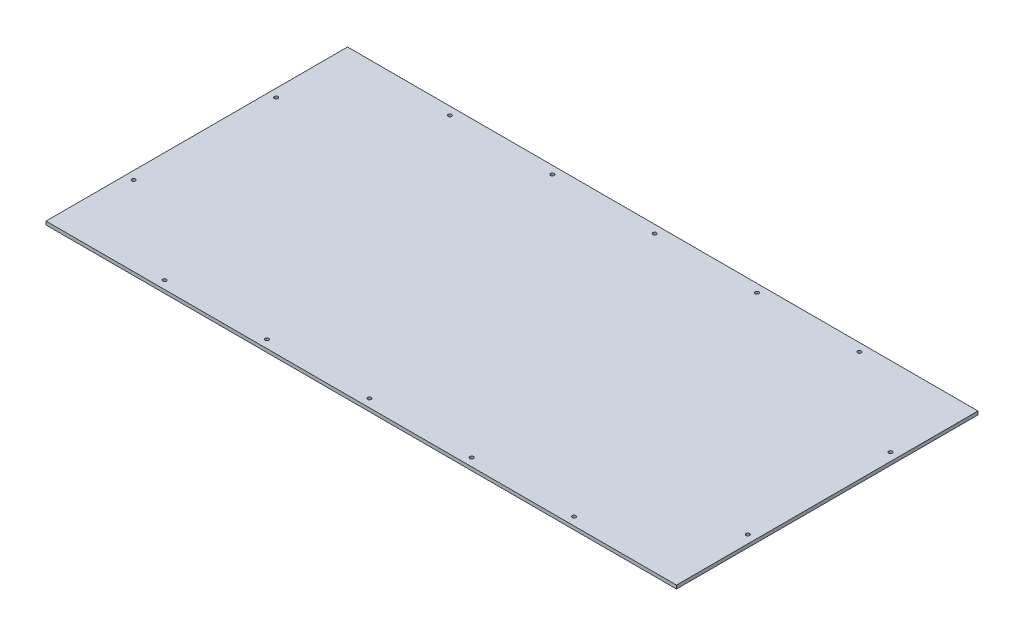
ISO-10303-21;
HEADER;
FILE_DESCRIPTION(('STEP AP214'),'2;1');
FILE_NAME('part.step','',(''),(''),'','','');
FILE_SCHEMA(('AUTOMOTIVE_DESIGN { 1 0 10303 214 1 1 1 1 }'));
ENDSEC;
DATA;
#1=APPLICATION_CONTEXT('core data for automotive mechanical design processes');
#2=APPLICATION_PROTOCOL_DEFINITION('international standard','automotive_design',2000,#1);
#3=PRODUCT_CONTEXT('',#1,'mechanical');
#4=PRODUCT('Part','Part','',(#3));
#5=PRODUCT_RELATED_PRODUCT_CATEGORY('part','',(#4));
#6=PRODUCT_DEFINITION_FORMATION('','',#4);
#7=PRODUCT_DEFINITION_CONTEXT('part definition',#1,'design');
#8=PRODUCT_DEFINITION('design','',#6,#7);
#9=PRODUCT_DEFINITION_SHAPE('','',#8);
#10=(LENGTH_UNIT() NAMED_UNIT(*) SI_UNIT(.MILLI.,.METRE.));
#11=(NAMED_UNIT(*) PLANE_ANGLE_UNIT() SI_UNIT($,.RADIAN.));
#12=(NAMED_UNIT(*) SI_UNIT($,.STERADIAN.) SOLID_ANGLE_UNIT());
#13=UNCERTAINTY_MEASURE_WITH_UNIT(LENGTH_MEASURE(1.E-05),#10,'distance_accuracy_value','');
#14=(GEOMETRIC_REPRESENTATION_CONTEXT(3) GLOBAL_UNCERTAINTY_ASSIGNED_CONTEXT((#13)) GLOBAL_UNIT_ASSIGNED_CONTEXT((#10,
#11,#12)) REPRESENTATION_CONTEXT('',''));
#15=CARTESIAN_POINT('',(0.,0.,0.));
#16=DIRECTION('',(0.,0.,1.));
#17=DIRECTION('',(1.,0.,0.));
#18=AXIS2_PLACEMENT_3D('',#15,#16,#17);
#19=CARTESIAN_POINT('',(0.,3.175,0.));
#20=DIRECTION('',(0.,1.,0.));
#21=DIRECTION('',(0.,0.,1.));
#22=AXIS2_PLACEMENT_3D('',#19,#20,#21);
#23=PLANE('',#22);
#24=CARTESIAN_POINT('',(1.66533453693773E-13,3.175,-132.2));
#25=DIRECTION('',(0.,1.,0.));
#26=DIRECTION('',(0.,0.,1.));
#27=AXIS2_PLACEMENT_3D('',#24,#25,#26);
#28=CIRCLE('',#27,1.65);
#29=CARTESIAN_POINT('',(1.66533453693773E-13,3.175,-130.55));
#30=VERTEX_POINT('',#29);
#31=EDGE_CURVE('E181',#30,#30,#28,.T.);
#32=ORIENTED_EDGE('',*,*,#31,.F.);
#33=EDGE_LOOP('',(#32));
#34=FACE_BOUND('',#33,.T.);
#35=CARTESIAN_POINT('',(284.6,3.175,66.0999999999999));
#36=DIRECTION('',(0.,1.,0.));
#37=DIRECTION('',(0.,0.,1.));
#38=AXIS2_PLACEMENT_3D('',#35,#36,#37);
#39=CIRCLE('',#38,1.64999999999999);
#40=CARTESIAN_POINT('',(284.6,3.175,67.7499999999999));
#41=VERTEX_POINT('',#40);
#42=EDGE_CURVE('E169',#41,#41,#39,.T.);
#43=ORIENTED_EDGE('',*,*,#42,.F.);
#44=EDGE_LOOP('',(#43));
#45=FACE_BOUND('',#44,.T.);
#46=CARTESIAN_POINT('',(94.8666666666667,3.175,-132.2));
#47=DIRECTION('',(0.,1.,0.));
#48=DIRECTION('',(0.,0.,-1.));
#49=AXIS2_PLACEMENT_3D('',#46,#47,#48);
#50=CIRCLE('',#49,1.65000000000002);
#51=CARTESIAN_POINT('',(94.8666666666667,3.175,-133.85));
#52=VERTEX_POINT('',#51);
#53=EDGE_CURVE('E157',#52,#52,#50,.T.);
#54=ORIENTED_EDGE('',*,*,#53,.F.);
#55=EDGE_LOOP('',(#54));
#56=FACE_BOUND('',#55,.T.);
#57=CARTESIAN_POINT('',(189.733333333333,3.175,132.2));
#58=DIRECTION('',(0.,1.,0.));
#59=DIRECTION('',(0.,0.,1.));
#60=AXIS2_PLACEMENT_3D('',#57,#58,#59);
#61=CIRCLE('',#60,1.65000000000002);
#62=CARTESIAN_POINT('',(189.733333333333,3.175,133.85));
#63=VERTEX_POINT('',#62);
#64=EDGE_CURVE('E145',#63,#63,#61,.T.);
#65=ORIENTED_EDGE('',*,*,#64,.F.);
#66=EDGE_LOOP('',(#65));
#67=FACE_BOUND('',#66,.T.);
#68=CARTESIAN_POINT('',(-94.8666666666666,3.175,132.2));
#69=DIRECTION('',(0.,1.,0.));
#70=DIRECTION('',(0.,0.,-1.));
#71=AXIS2_PLACEMENT_3D('',#68,#69,#70);
#72=CIRCLE('',#71,1.65000000000002);
#73=CARTESIAN_POINT('',(-94.8666666666666,3.175,130.55));
#74=VERTEX_POINT('',#73);
#75=EDGE_CURVE('E133',#74,#74,#72,.T.);
#76=ORIENTED_EDGE('',*,*,#75,.F.);
#77=EDGE_LOOP('',(#76));
#78=FACE_BOUND('',#77,.T.);
#79=CARTESIAN_POINT('',(-94.8666666666666,3.175,-132.2));
#80=DIRECTION('',(0.,1.,0.));
#81=DIRECTION('',(0.,0.,1.));
#82=AXIS2_PLACEMENT_3D('',#79,#80,#81);
#83=CIRCLE('',#82,1.65000000000002);
#84=CARTESIAN_POINT('',(-94.8666666666666,3.175,-130.55));
#85=VERTEX_POINT('',#84);
#86=EDGE_CURVE('E121',#85,#85,#83,.T.);
#87=ORIENTED_EDGE('',*,*,#86,.F.);
#88=EDGE_LOOP('',(#87));
#89=FACE_BOUND('',#88,.T.);
#90=CARTESIAN_POINT('',(-284.6,3.175,-66.1));
#91=DIRECTION('',(0.,1.,0.));
#92=DIRECTION('',(0.,0.,1.));
#93=AXIS2_PLACEMENT_3D('',#90,#91,#92);
#94=CIRCLE('',#93,1.64999999999999);
#95=CARTESIAN_POINT('',(-284.6,3.175,-64.45));
#96=VERTEX_POINT('',#95);
#97=EDGE_CURVE('E100',#96,#96,#94,.T.);
#98=ORIENTED_EDGE('',*,*,#97,.F.);
#99=EDGE_LOOP('',(#98));
#100=FACE_BOUND('',#99,.T.);
#101=DIRECTION('',(0.,0.,-1.));
#102=VECTOR('',#101,1.);
#103=CARTESIAN_POINT('',(292.1,3.175,-139.7));
#104=LINE('',#103,#102);
#105=CARTESIAN_POINT('',(292.1,3.175,139.7));
#106=VERTEX_POINT('',#105);
#107=CARTESIAN_POINT('',(292.1,3.175,-139.7));
#108=VERTEX_POINT('',#107);
#109=EDGE_CURVE('E85',#106,#108,#104,.T.);
#110=ORIENTED_EDGE('',*,*,#109,.T.);
#111=DIRECTION('',(-1.,0.,0.));
#112=VECTOR('',#111,1.);
#113=CARTESIAN_POINT('',(-292.1,3.175,-139.7));
#114=LINE('',#113,#112);
#115=CARTESIAN_POINT('',(-292.1,3.175,-139.7));
#116=VERTEX_POINT('',#115);
#117=EDGE_CURVE('E80',#108,#116,#114,.T.);
#118=ORIENTED_EDGE('',*,*,#117,.T.);
#119=DIRECTION('',(0.,0.,1.));
#120=VECTOR('',#119,1.);
#121=CARTESIAN_POINT('',(-292.1,3.175,-139.7));
#122=LINE('',#121,#120);
#123=CARTESIAN_POINT('',(-292.1,3.175,139.7));
#124=VERTEX_POINT('',#123);
#125=EDGE_CURVE('E83',#116,#124,#122,.T.);
#126=ORIENTED_EDGE('',*,*,#125,.T.);
#127=DIRECTION('',(1.,0.,0.));
#128=VECTOR('',#127,1.);
#129=CARTESIAN_POINT('',(-292.1,3.175,139.7));
#130=LINE('',#129,#128);
#131=EDGE_CURVE('E50',#124,#106,#130,.T.);
#132=ORIENTED_EDGE('',*,*,#131,.T.);
#133=EDGE_LOOP('',(#110,#118,#126,#132));
#134=FACE_BOUND('',#133,.T.);
#135=CARTESIAN_POINT('',(-189.733333333333,3.175,-132.2));
#136=DIRECTION('',(0.,1.,0.));
#137=DIRECTION('',(0.,0.,1.));
#138=AXIS2_PLACEMENT_3D('',#135,#136,#137);
#139=CIRCLE('',#138,1.65000000000002);
#140=CARTESIAN_POINT('',(-189.733333333333,3.175,-130.55));
#141=VERTEX_POINT('',#140);
#142=EDGE_CURVE('E115',#141,#141,#139,.T.);
#143=ORIENTED_EDGE('',*,*,#142,.F.);
#144=EDGE_LOOP('',(#143));
#145=FACE_BOUND('',#144,.T.);
#146=CARTESIAN_POINT('',(-284.6,3.175,66.0999999999999));
#147=DIRECTION('',(0.,1.,0.));
#148=DIRECTION('',(0.,0.,-1.));
#149=AXIS2_PLACEMENT_3D('',#146,#147,#148);
#150=CIRCLE('',#149,1.64999999999999);
#151=CARTESIAN_POINT('',(-284.6,3.175,64.4499999999999));
#152=VERTEX_POINT('',#151);
#153=EDGE_CURVE('E127',#152,#152,#150,.T.);
#154=ORIENTED_EDGE('',*,*,#153,.F.);
#155=EDGE_LOOP('',(#154));
#156=FACE_BOUND('',#155,.T.);
#157=CARTESIAN_POINT('',(-189.733333333333,3.175,132.2));
#158=DIRECTION('',(0.,1.,0.));
#159=DIRECTION('',(0.,0.,-1.));
#160=AXIS2_PLACEMENT_3D('',#157,#158,#159);
#161=CIRCLE('',#160,1.65000000000002);
#162=CARTESIAN_POINT('',(-189.733333333333,3.175,130.55));
#163=VERTEX_POINT('',#162);
#164=EDGE_CURVE('E139',#163,#163,#161,.T.);
#165=ORIENTED_EDGE('',*,*,#164,.F.);
#166=EDGE_LOOP('',(#165));
#167=FACE_BOUND('',#166,.T.);
#168=CARTESIAN_POINT('',(94.8666666666667,3.175,132.2));
#169=DIRECTION('',(0.,1.,0.));
#170=DIRECTION('',(0.,0.,1.));
#171=AXIS2_PLACEMENT_3D('',#168,#169,#170);
#172=CIRCLE('',#171,1.65000000000002);
#173=CARTESIAN_POINT('',(94.8666666666667,3.175,133.85));
#174=VERTEX_POINT('',#173);
#175=EDGE_CURVE('E151',#174,#174,#172,.T.);
#176=ORIENTED_EDGE('',*,*,#175,.F.);
#177=EDGE_LOOP('',(#176));
#178=FACE_BOUND('',#177,.T.);
#179=CARTESIAN_POINT('',(189.733333333333,3.175,-132.2));
#180=DIRECTION('',(0.,1.,0.));
#181=DIRECTION('',(0.,0.,-1.));
#182=AXIS2_PLACEMENT_3D('',#179,#180,#181);
#183=CIRCLE('',#182,1.65000000000002);
#184=CARTESIAN_POINT('',(189.733333333333,3.175,-133.85));
#185=VERTEX_POINT('',#184);
#186=EDGE_CURVE('E163',#185,#185,#183,.T.);
#187=ORIENTED_EDGE('',*,*,#186,.F.);
#188=EDGE_LOOP('',(#187));
#189=FACE_BOUND('',#188,.T.);
#190=CARTESIAN_POINT('',(284.6,3.175,-66.1));
#191=DIRECTION('',(0.,1.,0.));
#192=DIRECTION('',(0.,0.,-1.));
#193=AXIS2_PLACEMENT_3D('',#190,#191,#192);
#194=CIRCLE('',#193,1.64999999999999);
#195=CARTESIAN_POINT('',(284.6,3.175,-67.75));
#196=VERTEX_POINT('',#195);
#197=EDGE_CURVE('E175',#196,#196,#194,.T.);
#198=ORIENTED_EDGE('',*,*,#197,.F.);
#199=EDGE_LOOP('',(#198));
#200=FACE_BOUND('',#199,.T.);
#201=CARTESIAN_POINT('',(1.66533453693773E-13,3.175,132.2));
#202=DIRECTION('',(0.,1.,0.));
#203=DIRECTION('',(0.,0.,1.));
#204=AXIS2_PLACEMENT_3D('',#201,#202,#203);
#205=CIRCLE('',#204,1.65);
#206=CARTESIAN_POINT('',(1.66533453693773E-13,3.175,133.85));
#207=VERTEX_POINT('',#206);
#208=EDGE_CURVE('E187',#207,#207,#205,.T.);
#209=ORIENTED_EDGE('',*,*,#208,.F.);
#210=EDGE_LOOP('',(#209));
#211=FACE_BOUND('',#210,.T.);
#212=ADVANCED_FACE('F33',(#34,#45,#56,#67,#78,#89,#100,#134,#145,#156,#167,#178,#189,#200,#211),
#23,.T.);
#213=CARTESIAN_POINT('',(0.,0.,0.));
#214=DIRECTION('',(0.,1.,0.));
#215=DIRECTION('',(0.,0.,1.));
#216=AXIS2_PLACEMENT_3D('',#213,#214,#215);
#217=PLANE('',#216);
#218=DIRECTION('',(0.,0.,-1.));
#219=VECTOR('',#218,1.);
#220=CARTESIAN_POINT('',(292.1,0.,-139.7));
#221=LINE('',#220,#219);
#222=CARTESIAN_POINT('',(292.1,0.,139.7));
#223=VERTEX_POINT('',#222);
#224=CARTESIAN_POINT('',(292.1,0.,-139.7));
#225=VERTEX_POINT('',#224);
#226=EDGE_CURVE('E97',#223,#225,#221,.T.);
#227=ORIENTED_EDGE('',*,*,#226,.F.);
#228=DIRECTION('',(1.,0.,0.));
#229=VECTOR('',#228,1.);
#230=CARTESIAN_POINT('',(-292.1,0.,139.7));
#231=LINE('',#230,#229);
#232=CARTESIAN_POINT('',(-292.1,0.,139.7));
#233=VERTEX_POINT('',#232);
#234=EDGE_CURVE('E73',#233,#223,#231,.T.);
#235=ORIENTED_EDGE('',*,*,#234,.F.);
#236=DIRECTION('',(0.,0.,1.));
#237=VECTOR('',#236,1.);
#238=CARTESIAN_POINT('',(-292.1,0.,-139.7));
#239=LINE('',#238,#237);
#240=CARTESIAN_POINT('',(-292.1,0.,-139.7));
#241=VERTEX_POINT('',#240);
#242=EDGE_CURVE('E67',#241,#233,#239,.T.);
#243=ORIENTED_EDGE('',*,*,#242,.F.);
#244=DIRECTION('',(-1.,0.,0.));
#245=VECTOR('',#244,1.);
#246=CARTESIAN_POINT('',(-292.1,0.,-139.7));
#247=LINE('',#246,#245);
#248=EDGE_CURVE('E89',#225,#241,#247,.T.);
#249=ORIENTED_EDGE('',*,*,#248,.F.);
#250=EDGE_LOOP('',(#227,#235,#243,#249));
#251=FACE_BOUND('',#250,.T.);
#252=CARTESIAN_POINT('',(-284.6,0.,-66.1));
#253=DIRECTION('',(0.,1.,0.));
#254=DIRECTION('',(0.,0.,1.));
#255=AXIS2_PLACEMENT_3D('',#252,#253,#254);
#256=CIRCLE('',#255,1.64999999999999);
#257=CARTESIAN_POINT('',(-284.6,0.,-64.45));
#258=VERTEX_POINT('',#257);
#259=EDGE_CURVE('E112',#258,#258,#256,.T.);
#260=ORIENTED_EDGE('',*,*,#259,.T.);
#261=EDGE_LOOP('',(#260));
#262=FACE_BOUND('',#261,.T.);
#263=CARTESIAN_POINT('',(-189.733333333333,0.,-132.2));
#264=DIRECTION('',(0.,1.,0.));
#265=DIRECTION('',(0.,0.,1.));
#266=AXIS2_PLACEMENT_3D('',#263,#264,#265);
#267=CIRCLE('',#266,1.65000000000002);
#268=CARTESIAN_POINT('',(-189.733333333333,0.,-130.55));
#269=VERTEX_POINT('',#268);
#270=EDGE_CURVE('E118',#269,#269,#267,.T.);
#271=ORIENTED_EDGE('',*,*,#270,.T.);
#272=EDGE_LOOP('',(#271));
#273=FACE_BOUND('',#272,.T.);
#274=CARTESIAN_POINT('',(-94.8666666666666,0.,-132.2));
#275=DIRECTION('',(0.,1.,0.));
#276=DIRECTION('',(0.,0.,1.));
#277=AXIS2_PLACEMENT_3D('',#274,#275,#276);
#278=CIRCLE('',#277,1.65000000000002);
#279=CARTESIAN_POINT('',(-94.8666666666666,0.,-130.55));
#280=VERTEX_POINT('',#279);
#281=EDGE_CURVE('E124',#280,#280,#278,.T.);
#282=ORIENTED_EDGE('',*,*,#281,.T.);
#283=EDGE_LOOP('',(#282));
#284=FACE_BOUND('',#283,.T.);
#285=CARTESIAN_POINT('',(-284.6,0.,66.0999999999999));
#286=DIRECTION('',(0.,1.,0.));
#287=DIRECTION('',(0.,0.,-1.));
#288=AXIS2_PLACEMENT_3D('',#285,#286,#287);
#289=CIRCLE('',#288,1.64999999999999);
#290=CARTESIAN_POINT('',(-284.6,0.,64.4499999999999));
#291=VERTEX_POINT('',#290);
#292=EDGE_CURVE('E130',#291,#291,#289,.T.);
#293=ORIENTED_EDGE('',*,*,#292,.T.);
#294=EDGE_LOOP('',(#293));
#295=FACE_BOUND('',#294,.T.);
#296=CARTESIAN_POINT('',(-94.8666666666666,0.,132.2));
#297=DIRECTION('',(0.,1.,0.));
#298=DIRECTION('',(0.,0.,-1.));
#299=AXIS2_PLACEMENT_3D('',#296,#297,#298);
#300=CIRCLE('',#299,1.65000000000002);
#301=CARTESIAN_POINT('',(-94.8666666666666,0.,130.55));
#302=VERTEX_POINT('',#301);
#303=EDGE_CURVE('E136',#302,#302,#300,.T.);
#304=ORIENTED_EDGE('',*,*,#303,.T.);
#305=EDGE_LOOP('',(#304));
#306=FACE_BOUND('',#305,.T.);
#307=CARTESIAN_POINT('',(-189.733333333333,0.,132.2));
#308=DIRECTION('',(0.,1.,0.));
#309=DIRECTION('',(0.,0.,-1.));
#310=AXIS2_PLACEMENT_3D('',#307,#308,#309);
#311=CIRCLE('',#310,1.65000000000002);
#312=CARTESIAN_POINT('',(-189.733333333333,0.,130.55));
#313=VERTEX_POINT('',#312);
#314=EDGE_CURVE('E142',#313,#313,#311,.T.);
#315=ORIENTED_EDGE('',*,*,#314,.T.);
#316=EDGE_LOOP('',(#315));
#317=FACE_BOUND('',#316,.T.);
#318=CARTESIAN_POINT('',(189.733333333333,0.,132.2));
#319=DIRECTION('',(0.,1.,0.));
#320=DIRECTION('',(0.,0.,1.));
#321=AXIS2_PLACEMENT_3D('',#318,#319,#320);
#322=CIRCLE('',#321,1.65000000000002);
#323=CARTESIAN_POINT('',(189.733333333333,0.,133.85));
#324=VERTEX_POINT('',#323);
#325=EDGE_CURVE('E148',#324,#324,#322,.T.);
#326=ORIENTED_EDGE('',*,*,#325,.T.);
#327=EDGE_LOOP('',(#326));
#328=FACE_BOUND('',#327,.T.);
#329=CARTESIAN_POINT('',(94.8666666666667,0.,132.2));
#330=DIRECTION('',(0.,1.,0.));
#331=DIRECTION('',(0.,0.,1.));
#332=AXIS2_PLACEMENT_3D('',#329,#330,#331);
#333=CIRCLE('',#332,1.65000000000002);
#334=CARTESIAN_POINT('',(94.8666666666667,0.,133.85));
#335=VERTEX_POINT('',#334);
#336=EDGE_CURVE('E154',#335,#335,#333,.T.);
#337=ORIENTED_EDGE('',*,*,#336,.T.);
#338=EDGE_LOOP('',(#337));
#339=FACE_BOUND('',#338,.T.);
#340=CARTESIAN_POINT('',(94.8666666666667,0.,-132.2));
#341=DIRECTION('',(0.,1.,0.));
#342=DIRECTION('',(0.,0.,-1.));
#343=AXIS2_PLACEMENT_3D('',#340,#341,#342);
#344=CIRCLE('',#343,1.65000000000002);
#345=CARTESIAN_POINT('',(94.8666666666667,0.,-133.85));
#346=VERTEX_POINT('',#345);
#347=EDGE_CURVE('E160',#346,#346,#344,.T.);
#348=ORIENTED_EDGE('',*,*,#347,.T.);
#349=EDGE_LOOP('',(#348));
#350=FACE_BOUND('',#349,.T.);
#351=CARTESIAN_POINT('',(189.733333333333,0.,-132.2));
#352=DIRECTION('',(0.,1.,0.));
#353=DIRECTION('',(0.,0.,-1.));
#354=AXIS2_PLACEMENT_3D('',#351,#352,#353);
#355=CIRCLE('',#354,1.65000000000002);
#356=CARTESIAN_POINT('',(189.733333333333,0.,-133.85));
#357=VERTEX_POINT('',#356);
#358=EDGE_CURVE('E166',#357,#357,#355,.T.);
#359=ORIENTED_EDGE('',*,*,#358,.T.);
#360=EDGE_LOOP('',(#359));
#361=FACE_BOUND('',#360,.T.);
#362=CARTESIAN_POINT('',(284.6,0.,66.0999999999999));
#363=DIRECTION('',(0.,1.,0.));
#364=DIRECTION('',(0.,0.,1.));
#365=AXIS2_PLACEMENT_3D('',#362,#363,#364);
#366=CIRCLE('',#365,1.64999999999999);
#367=CARTESIAN_POINT('',(284.6,0.,67.7499999999999));
#368=VERTEX_POINT('',#367);
#369=EDGE_CURVE('E172',#368,#368,#366,.T.);
#370=ORIENTED_EDGE('',*,*,#369,.T.);
#371=EDGE_LOOP('',(#370));
#372=FACE_BOUND('',#371,.T.);
#373=CARTESIAN_POINT('',(284.6,0.,-66.1));
#374=DIRECTION('',(0.,1.,0.));
#375=DIRECTION('',(0.,0.,-1.));
#376=AXIS2_PLACEMENT_3D('',#373,#374,#375);
#377=CIRCLE('',#376,1.64999999999999);
#378=CARTESIAN_POINT('',(284.6,0.,-67.75));
#379=VERTEX_POINT('',#378);
#380=EDGE_CURVE('E178',#379,#379,#377,.T.);
#381=ORIENTED_EDGE('',*,*,#380,.T.);
#382=EDGE_LOOP('',(#381));
#383=FACE_BOUND('',#382,.T.);
#384=CARTESIAN_POINT('',(1.66533453693773E-13,0.,-132.2));
#385=DIRECTION('',(0.,1.,0.));
#386=DIRECTION('',(0.,0.,1.));
#387=AXIS2_PLACEMENT_3D('',#384,#385,#386);
#388=CIRCLE('',#387,1.65);
#389=CARTESIAN_POINT('',(1.66533453693773E-13,0.,-130.55));
#390=VERTEX_POINT('',#389);
#391=EDGE_CURVE('E184',#390,#390,#388,.T.);
#392=ORIENTED_EDGE('',*,*,#391,.T.);
#393=EDGE_LOOP('',(#392));
#394=FACE_BOUND('',#393,.T.);
#395=CARTESIAN_POINT('',(1.66533453693773E-13,0.,132.2));
#396=DIRECTION('',(0.,1.,0.));
#397=DIRECTION('',(0.,0.,1.));
#398=AXIS2_PLACEMENT_3D('',#395,#396,#397);
#399=CIRCLE('',#398,1.65);
#400=CARTESIAN_POINT('',(1.66533453693773E-13,0.,133.85));
#401=VERTEX_POINT('',#400);
#402=EDGE_CURVE('E190',#401,#401,#399,.T.);
#403=ORIENTED_EDGE('',*,*,#402,.T.);
#404=EDGE_LOOP('',(#403));
#405=FACE_BOUND('',#404,.T.);
#406=ADVANCED_FACE('F108',(#251,#262,#273,#284,#295,#306,#317,#328,#339,#350,#361,#372,#383,
#394,#405),#217,.F.);
#407=CARTESIAN_POINT('',(292.1,3.175,-139.7));
#408=DIRECTION('',(-1.,0.,0.));
#409=DIRECTION('',(0.,0.,1.));
#410=AXIS2_PLACEMENT_3D('',#407,#408,#409);
#411=PLANE('',#410);
#412=ORIENTED_EDGE('',*,*,#226,.T.);
#413=DIRECTION('',(0.,-1.,0.));
#414=VECTOR('',#413,1.);
#415=CARTESIAN_POINT('',(292.1,3.175,-139.7));
#416=LINE('',#415,#414);
#417=EDGE_CURVE('E11',#108,#225,#416,.T.);
#418=ORIENTED_EDGE('',*,*,#417,.F.);
#419=ORIENTED_EDGE('',*,*,#109,.F.);
#420=DIRECTION('',(0.,-1.,0.));
#421=VECTOR('',#420,1.);
#422=CARTESIAN_POINT('',(292.1,3.175,139.7));
#423=LINE('',#422,#421);
#424=EDGE_CURVE('E93',#106,#223,#423,.T.);
#425=ORIENTED_EDGE('',*,*,#424,.T.);
#426=EDGE_LOOP('',(#412,#418,#419,#425));
#427=FACE_BOUND('',#426,.T.);
#428=ADVANCED_FACE('F35',(#427),#411,.F.);
#429=CARTESIAN_POINT('',(-292.1,3.175,-139.7));
#430=DIRECTION('',(0.,0.,1.));
#431=DIRECTION('',(1.,0.,0.));
#432=AXIS2_PLACEMENT_3D('',#429,#430,#431);
#433=PLANE('',#432);
#434=ORIENTED_EDGE('',*,*,#248,.T.);
#435=DIRECTION('',(0.,-1.,0.));
#436=VECTOR('',#435,1.);
#437=CARTESIAN_POINT('',(-292.1,3.175,-139.7));
#438=LINE('',#437,#436);
#439=EDGE_CURVE('E42',#116,#241,#438,.T.);
#440=ORIENTED_EDGE('',*,*,#439,.F.);
#441=ORIENTED_EDGE('',*,*,#117,.F.);
#442=ORIENTED_EDGE('',*,*,#417,.T.);
#443=EDGE_LOOP('',(#434,#440,#441,#442));
#444=FACE_BOUND('',#443,.T.);
#445=ADVANCED_FACE('F88',(#444),#433,.F.);
#446=CARTESIAN_POINT('',(-292.1,3.175,-139.7));
#447=DIRECTION('',(1.,0.,0.));
#448=DIRECTION('',(0.,0.,-1.));
#449=AXIS2_PLACEMENT_3D('',#446,#447,#448);
#450=PLANE('',#449);
#451=ORIENTED_EDGE('',*,*,#242,.T.);
#452=DIRECTION('',(0.,-1.,0.));
#453=VECTOR('',#452,1.);
#454=CARTESIAN_POINT('',(-292.1,3.175,139.7));
#455=LINE('',#454,#453);
#456=EDGE_CURVE('E90',#124,#233,#455,.T.);
#457=ORIENTED_EDGE('',*,*,#456,.F.);
#458=ORIENTED_EDGE('',*,*,#125,.F.);
#459=ORIENTED_EDGE('',*,*,#439,.T.);
#460=EDGE_LOOP('',(#451,#457,#458,#459));
#461=FACE_BOUND('',#460,.T.);
#462=ADVANCED_FACE('F91',(#461),#450,.F.);
#463=CARTESIAN_POINT('',(-292.1,3.175,139.7));
#464=DIRECTION('',(0.,0.,-1.));
#465=DIRECTION('',(-1.,0.,0.));
#466=AXIS2_PLACEMENT_3D('',#463,#464,#465);
#467=PLANE('',#466);
#468=ORIENTED_EDGE('',*,*,#234,.T.);
#469=ORIENTED_EDGE('',*,*,#424,.F.);
#470=ORIENTED_EDGE('',*,*,#131,.F.);
#471=ORIENTED_EDGE('',*,*,#456,.T.);
#472=EDGE_LOOP('',(#468,#469,#470,#471));
#473=FACE_BOUND('',#472,.T.);
#474=ADVANCED_FACE('F105',(#473),#467,.F.);
#475=CARTESIAN_POINT('',(-284.6,3.175,-66.1));
#476=DIRECTION('',(0.,-1.,0.));
#477=DIRECTION('',(0.,0.,-1.));
#478=AXIS2_PLACEMENT_3D('',#475,#476,#477);
#479=CYLINDRICAL_SURFACE('',#478,1.64999999999999);
#480=ORIENTED_EDGE('',*,*,#97,.T.);
#481=EDGE_LOOP('',(#480));
#482=FACE_BOUND('',#481,.T.);
#483=ORIENTED_EDGE('',*,*,#259,.F.);
#484=EDGE_LOOP('',(#483));
#485=FACE_BOUND('',#484,.T.);
#486=ADVANCED_FACE('F209',(#482,#485),#479,.F.);
#487=CARTESIAN_POINT('',(-189.733333333333,3.175,-132.2));
#488=DIRECTION('',(0.,-1.,0.));
#489=DIRECTION('',(0.,0.,-1.));
#490=AXIS2_PLACEMENT_3D('',#487,#488,#489);
#491=CYLINDRICAL_SURFACE('',#490,1.65000000000002);
#492=ORIENTED_EDGE('',*,*,#142,.T.);
#493=EDGE_LOOP('',(#492));
#494=FACE_BOUND('',#493,.T.);
#495=ORIENTED_EDGE('',*,*,#270,.F.);
#496=EDGE_LOOP('',(#495));
#497=FACE_BOUND('',#496,.T.);
#498=ADVANCED_FACE('F255',(#494,#497),#491,.F.);
#499=CARTESIAN_POINT('',(-94.8666666666666,3.175,-132.2));
#500=DIRECTION('',(0.,-1.,0.));
#501=DIRECTION('',(0.,0.,-1.));
#502=AXIS2_PLACEMENT_3D('',#499,#500,#501);
#503=CYLINDRICAL_SURFACE('',#502,1.65000000000002);
#504=ORIENTED_EDGE('',*,*,#86,.T.);
#505=EDGE_LOOP('',(#504));
#506=FACE_BOUND('',#505,.T.);
#507=ORIENTED_EDGE('',*,*,#281,.F.);
#508=EDGE_LOOP('',(#507));
#509=FACE_BOUND('',#508,.T.);
#510=ADVANCED_FACE('F263',(#506,#509),#503,.F.);
#511=CARTESIAN_POINT('',(-284.6,3.175,66.0999999999999));
#512=DIRECTION('',(0.,-1.,0.));
#513=DIRECTION('',(0.,0.,-1.));
#514=AXIS2_PLACEMENT_3D('',#511,#512,#513);
#515=CYLINDRICAL_SURFACE('',#514,1.64999999999999);
#516=ORIENTED_EDGE('',*,*,#153,.T.);
#517=EDGE_LOOP('',(#516));
#518=FACE_BOUND('',#517,.T.);
#519=ORIENTED_EDGE('',*,*,#292,.F.);
#520=EDGE_LOOP('',(#519));
#521=FACE_BOUND('',#520,.T.);
#522=ADVANCED_FACE('F271',(#518,#521),#515,.F.);
#523=CARTESIAN_POINT('',(-94.8666666666666,3.175,132.2));
#524=DIRECTION('',(0.,-1.,0.));
#525=DIRECTION('',(0.,0.,-1.));
#526=AXIS2_PLACEMENT_3D('',#523,#524,#525);
#527=CYLINDRICAL_SURFACE('',#526,1.65000000000002);
#528=ORIENTED_EDGE('',*,*,#75,.T.);
#529=EDGE_LOOP('',(#528));
#530=FACE_BOUND('',#529,.T.);
#531=ORIENTED_EDGE('',*,*,#303,.F.);
#532=EDGE_LOOP('',(#531));
#533=FACE_BOUND('',#532,.T.);
#534=ADVANCED_FACE('F280',(#530,#533),#527,.F.);
#535=CARTESIAN_POINT('',(-189.733333333333,3.175,132.2));
#536=DIRECTION('',(0.,-1.,0.));
#537=DIRECTION('',(0.,0.,-1.));
#538=AXIS2_PLACEMENT_3D('',#535,#536,#537);
#539=CYLINDRICAL_SURFACE('',#538,1.65000000000002);
#540=ORIENTED_EDGE('',*,*,#164,.T.);
#541=EDGE_LOOP('',(#540));
#542=FACE_BOUND('',#541,.T.);
#543=ORIENTED_EDGE('',*,*,#314,.F.);
#544=EDGE_LOOP('',(#543));
#545=FACE_BOUND('',#544,.T.);
#546=ADVANCED_FACE('F289',(#542,#545),#539,.F.);
#547=CARTESIAN_POINT('',(189.733333333333,3.175,132.2));
#548=DIRECTION('',(0.,-1.,0.));
#549=DIRECTION('',(0.,0.,-1.));
#550=AXIS2_PLACEMENT_3D('',#547,#548,#549);
#551=CYLINDRICAL_SURFACE('',#550,1.65000000000002);
#552=ORIENTED_EDGE('',*,*,#64,.T.);
#553=EDGE_LOOP('',(#552));
#554=FACE_BOUND('',#553,.T.);
#555=ORIENTED_EDGE('',*,*,#325,.F.);
#556=EDGE_LOOP('',(#555));
#557=FACE_BOUND('',#556,.T.);
#558=ADVANCED_FACE('F298',(#554,#557),#551,.F.);
#559=CARTESIAN_POINT('',(94.8666666666667,3.175,132.2));
#560=DIRECTION('',(0.,-1.,0.));
#561=DIRECTION('',(0.,0.,-1.));
#562=AXIS2_PLACEMENT_3D('',#559,#560,#561);
#563=CYLINDRICAL_SURFACE('',#562,1.65000000000002);
#564=ORIENTED_EDGE('',*,*,#175,.T.);
#565=EDGE_LOOP('',(#564));
#566=FACE_BOUND('',#565,.T.);
#567=ORIENTED_EDGE('',*,*,#336,.F.);
#568=EDGE_LOOP('',(#567));
#569=FACE_BOUND('',#568,.T.);
#570=ADVANCED_FACE('F307',(#566,#569),#563,.F.);
#571=CARTESIAN_POINT('',(94.8666666666667,3.175,-132.2));
#572=DIRECTION('',(0.,-1.,0.));
#573=DIRECTION('',(0.,0.,-1.));
#574=AXIS2_PLACEMENT_3D('',#571,#572,#573);
#575=CYLINDRICAL_SURFACE('',#574,1.65000000000002);
#576=ORIENTED_EDGE('',*,*,#53,.T.);
#577=EDGE_LOOP('',(#576));
#578=FACE_BOUND('',#577,.T.);
#579=ORIENTED_EDGE('',*,*,#347,.F.);
#580=EDGE_LOOP('',(#579));
#581=FACE_BOUND('',#580,.T.);
#582=ADVANCED_FACE('F316',(#578,#581),#575,.F.);
#583=CARTESIAN_POINT('',(189.733333333333,3.175,-132.2));
#584=DIRECTION('',(0.,-1.,0.));
#585=DIRECTION('',(0.,0.,-1.));
#586=AXIS2_PLACEMENT_3D('',#583,#584,#585);
#587=CYLINDRICAL_SURFACE('',#586,1.65000000000002);
#588=ORIENTED_EDGE('',*,*,#186,.T.);
#589=EDGE_LOOP('',(#588));
#590=FACE_BOUND('',#589,.T.);
#591=ORIENTED_EDGE('',*,*,#358,.F.);
#592=EDGE_LOOP('',(#591));
#593=FACE_BOUND('',#592,.T.);
#594=ADVANCED_FACE('F325',(#590,#593),#587,.F.);
#595=CARTESIAN_POINT('',(284.6,3.175,66.0999999999999));
#596=DIRECTION('',(0.,-1.,0.));
#597=DIRECTION('',(0.,0.,-1.));
#598=AXIS2_PLACEMENT_3D('',#595,#596,#597);
#599=CYLINDRICAL_SURFACE('',#598,1.64999999999999);
#600=ORIENTED_EDGE('',*,*,#42,.T.);
#601=EDGE_LOOP('',(#600));
#602=FACE_BOUND('',#601,.T.);
#603=ORIENTED_EDGE('',*,*,#369,.F.);
#604=EDGE_LOOP('',(#603));
#605=FACE_BOUND('',#604,.T.);
#606=ADVANCED_FACE('F334',(#602,#605),#599,.F.);
#607=CARTESIAN_POINT('',(284.6,3.175,-66.1));
#608=DIRECTION('',(0.,-1.,0.));
#609=DIRECTION('',(0.,0.,-1.));
#610=AXIS2_PLACEMENT_3D('',#607,#608,#609);
#611=CYLINDRICAL_SURFACE('',#610,1.64999999999999);
#612=ORIENTED_EDGE('',*,*,#197,.T.);
#613=EDGE_LOOP('',(#612));
#614=FACE_BOUND('',#613,.T.);
#615=ORIENTED_EDGE('',*,*,#380,.F.);
#616=EDGE_LOOP('',(#615));
#617=FACE_BOUND('',#616,.T.);
#618=ADVANCED_FACE('F343',(#614,#617),#611,.F.);
#619=CARTESIAN_POINT('',(1.66533453693773E-13,3.175,-132.2));
#620=DIRECTION('',(0.,-1.,0.));
#621=DIRECTION('',(0.,0.,-1.));
#622=AXIS2_PLACEMENT_3D('',#619,#620,#621);
#623=CYLINDRICAL_SURFACE('',#622,1.65);
#624=ORIENTED_EDGE('',*,*,#31,.T.);
#625=EDGE_LOOP('',(#624));
#626=FACE_BOUND('',#625,.T.);
#627=ORIENTED_EDGE('',*,*,#391,.F.);
#628=EDGE_LOOP('',(#627));
#629=FACE_BOUND('',#628,.T.);
#630=ADVANCED_FACE('F352',(#626,#629),#623,.F.);
#631=CARTESIAN_POINT('',(1.66533453693773E-13,3.175,132.2));
#632=DIRECTION('',(0.,-1.,0.));
#633=DIRECTION('',(0.,0.,-1.));
#634=AXIS2_PLACEMENT_3D('',#631,#632,#633);
#635=CYLINDRICAL_SURFACE('',#634,1.65);
#636=ORIENTED_EDGE('',*,*,#208,.T.);
#637=EDGE_LOOP('',(#636));
#638=FACE_BOUND('',#637,.T.);
#639=ORIENTED_EDGE('',*,*,#402,.F.);
#640=EDGE_LOOP('',(#639));
#641=FACE_BOUND('',#640,.T.);
#642=ADVANCED_FACE('F196',(#638,#641),#635,.F.);
#643=CLOSED_SHELL('',(#212,#406,#428,#445,#462,#474,#486,#498,#510,#522,#534,#546,#558,#570,
#582,#594,#606,#618,#630,#642));
#644=MANIFOLD_SOLID_BREP('B2',#643);
#645=ADVANCED_BREP_SHAPE_REPRESENTATION('',(#18,#644),#14);
#646=SHAPE_DEFINITION_REPRESENTATION(#9,#645);
ENDSEC;
END-ISO-10303-21;
